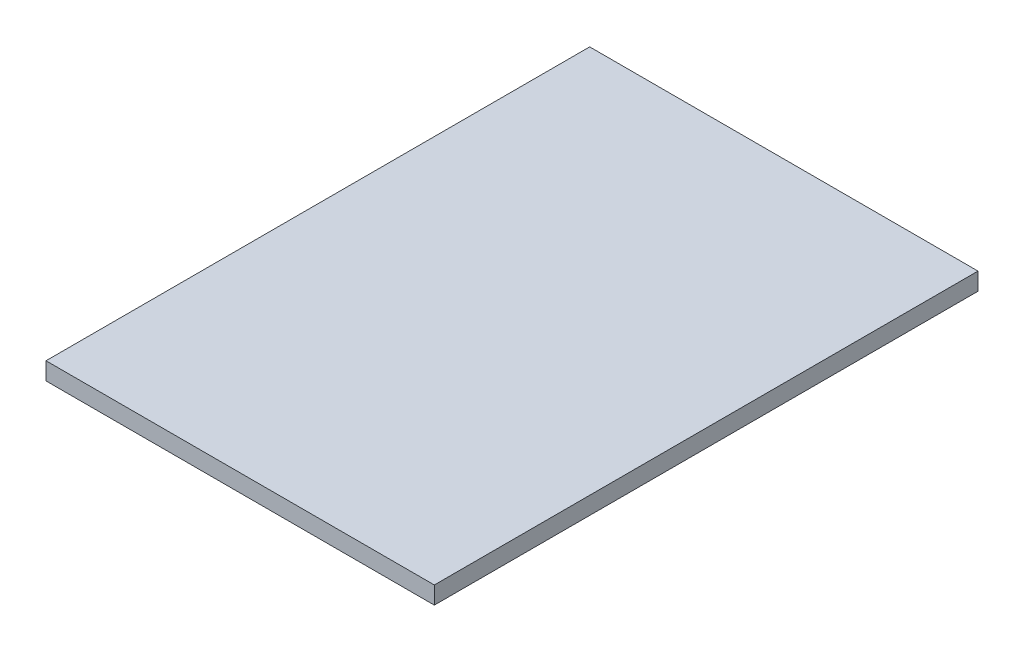
ISO-10303-21;
HEADER;
FILE_DESCRIPTION(('STEP AP214'),'2;1');
FILE_NAME('part.step','',(''),(''),'','','');
FILE_SCHEMA(('AUTOMOTIVE_DESIGN { 1 0 10303 214 1 1 1 1 }'));
ENDSEC;
DATA;
#1=APPLICATION_CONTEXT('core data for automotive mechanical design processes');
#2=APPLICATION_PROTOCOL_DEFINITION('international standard','automotive_design',2000,#1);
#3=PRODUCT_CONTEXT('',#1,'mechanical');
#4=PRODUCT('Part','Part','',(#3));
#5=PRODUCT_RELATED_PRODUCT_CATEGORY('part','',(#4));
#6=PRODUCT_DEFINITION_FORMATION('','',#4);
#7=PRODUCT_DEFINITION_CONTEXT('part definition',#1,'design');
#8=PRODUCT_DEFINITION('design','',#6,#7);
#9=PRODUCT_DEFINITION_SHAPE('','',#8);
#10=(LENGTH_UNIT() NAMED_UNIT(*) SI_UNIT(.MILLI.,.METRE.));
#11=(NAMED_UNIT(*) PLANE_ANGLE_UNIT() SI_UNIT($,.RADIAN.));
#12=(NAMED_UNIT(*) SI_UNIT($,.STERADIAN.) SOLID_ANGLE_UNIT());
#13=UNCERTAINTY_MEASURE_WITH_UNIT(LENGTH_MEASURE(1.E-05),#10,'distance_accuracy_value','');
#14=(GEOMETRIC_REPRESENTATION_CONTEXT(3) GLOBAL_UNCERTAINTY_ASSIGNED_CONTEXT((#13)) GLOBAL_UNIT_ASSIGNED_CONTEXT((#10,
#11,#12)) REPRESENTATION_CONTEXT('',''));
#15=CARTESIAN_POINT('',(0.,0.,0.));
#16=DIRECTION('',(0.,0.,1.));
#17=DIRECTION('',(1.,0.,0.));
#18=AXIS2_PLACEMENT_3D('',#15,#16,#17);
#19=CARTESIAN_POINT('',(10.,0.9,14.));
#20=DIRECTION('',(-1.,0.,0.));
#21=DIRECTION('',(0.,0.,1.));
#22=AXIS2_PLACEMENT_3D('',#19,#20,#21);
#23=PLANE('',#22);
#24=DIRECTION('',(0.,0.,-1.));
#25=VECTOR('',#24,1.);
#26=CARTESIAN_POINT('',(10.,0.,14.));
#27=LINE('',#26,#25);
#28=CARTESIAN_POINT('',(10.,0.,14.));
#29=VERTEX_POINT('',#28);
#30=CARTESIAN_POINT('',(10.,0.,-14.));
#31=VERTEX_POINT('',#30);
#32=EDGE_CURVE('E95',#29,#31,#27,.T.);
#33=ORIENTED_EDGE('',*,*,#32,.T.);
#34=DIRECTION('',(0.,-1.,0.));
#35=VECTOR('',#34,1.);
#36=CARTESIAN_POINT('',(10.,0.9,-14.));
#37=LINE('',#36,#35);
#38=CARTESIAN_POINT('',(10.,0.9,-14.));
#39=VERTEX_POINT('',#38);
#40=EDGE_CURVE('E11',#39,#31,#37,.T.);
#41=ORIENTED_EDGE('',*,*,#40,.F.);
#42=DIRECTION('',(0.,0.,-1.));
#43=VECTOR('',#42,1.);
#44=CARTESIAN_POINT('',(10.,0.9,14.));
#45=LINE('',#44,#43);
#46=CARTESIAN_POINT('',(10.,0.9,14.));
#47=VERTEX_POINT('',#46);
#48=EDGE_CURVE('E83',#47,#39,#45,.T.);
#49=ORIENTED_EDGE('',*,*,#48,.F.);
#50=DIRECTION('',(0.,-1.,0.));
#51=VECTOR('',#50,1.);
#52=CARTESIAN_POINT('',(10.,0.9,14.));
#53=LINE('',#52,#51);
#54=EDGE_CURVE('E91',#47,#29,#53,.T.);
#55=ORIENTED_EDGE('',*,*,#54,.T.);
#56=EDGE_LOOP('',(#33,#41,#49,#55));
#57=FACE_BOUND('',#56,.T.);
#58=ADVANCED_FACE('F32',(#57),#23,.F.);
#59=CARTESIAN_POINT('',(-10.,0.9,-14.));
#60=DIRECTION('',(0.,0.,1.));
#61=DIRECTION('',(1.,0.,0.));
#62=AXIS2_PLACEMENT_3D('',#59,#60,#61);
#63=PLANE('',#62);
#64=DIRECTION('',(-1.,0.,0.));
#65=VECTOR('',#64,1.);
#66=CARTESIAN_POINT('',(-10.,0.,-14.));
#67=LINE('',#66,#65);
#68=CARTESIAN_POINT('',(-10.,0.,-14.));
#69=VERTEX_POINT('',#68);
#70=EDGE_CURVE('E87',#31,#69,#67,.T.);
#71=ORIENTED_EDGE('',*,*,#70,.T.);
#72=DIRECTION('',(0.,-1.,0.));
#73=VECTOR('',#72,1.);
#74=CARTESIAN_POINT('',(-10.,0.9,-14.));
#75=LINE('',#74,#73);
#76=CARTESIAN_POINT('',(-10.,0.9,-14.));
#77=VERTEX_POINT('',#76);
#78=EDGE_CURVE('E40',#77,#69,#75,.T.);
#79=ORIENTED_EDGE('',*,*,#78,.F.);
#80=DIRECTION('',(-1.,0.,0.));
#81=VECTOR('',#80,1.);
#82=CARTESIAN_POINT('',(-10.,0.9,-14.));
#83=LINE('',#82,#81);
#84=EDGE_CURVE('E78',#39,#77,#83,.T.);
#85=ORIENTED_EDGE('',*,*,#84,.F.);
#86=ORIENTED_EDGE('',*,*,#40,.T.);
#87=EDGE_LOOP('',(#71,#79,#85,#86));
#88=FACE_BOUND('',#87,.T.);
#89=ADVANCED_FACE('F86',(#88),#63,.F.);
#90=CARTESIAN_POINT('',(-10.,0.9,14.));
#91=DIRECTION('',(1.,0.,0.));
#92=DIRECTION('',(0.,0.,-1.));
#93=AXIS2_PLACEMENT_3D('',#90,#91,#92);
#94=PLANE('',#93);
#95=DIRECTION('',(0.,0.,1.));
#96=VECTOR('',#95,1.);
#97=CARTESIAN_POINT('',(-10.,0.,14.));
#98=LINE('',#97,#96);
#99=CARTESIAN_POINT('',(-10.,0.,14.));
#100=VERTEX_POINT('',#99);
#101=EDGE_CURVE('E65',#69,#100,#98,.T.);
#102=ORIENTED_EDGE('',*,*,#101,.T.);
#103=DIRECTION('',(0.,-1.,0.));
#104=VECTOR('',#103,1.);
#105=CARTESIAN_POINT('',(-10.,0.9,14.));
#106=LINE('',#105,#104);
#107=CARTESIAN_POINT('',(-10.,0.9,14.));
#108=VERTEX_POINT('',#107);
#109=EDGE_CURVE('E88',#108,#100,#106,.T.);
#110=ORIENTED_EDGE('',*,*,#109,.F.);
#111=DIRECTION('',(0.,0.,1.));
#112=VECTOR('',#111,1.);
#113=CARTESIAN_POINT('',(-10.,0.9,14.));
#114=LINE('',#113,#112);
#115=EDGE_CURVE('E81',#77,#108,#114,.T.);
#116=ORIENTED_EDGE('',*,*,#115,.F.);
#117=ORIENTED_EDGE('',*,*,#78,.T.);
#118=EDGE_LOOP('',(#102,#110,#116,#117));
#119=FACE_BOUND('',#118,.T.);
#120=ADVANCED_FACE('F89',(#119),#94,.F.);
#121=CARTESIAN_POINT('',(-10.,0.9,14.));
#122=DIRECTION('',(0.,0.,-1.));
#123=DIRECTION('',(-1.,0.,0.));
#124=AXIS2_PLACEMENT_3D('',#121,#122,#123);
#125=PLANE('',#124);
#126=DIRECTION('',(1.,0.,0.));
#127=VECTOR('',#126,1.);
#128=CARTESIAN_POINT('',(-10.,0.,14.));
#129=LINE('',#128,#127);
#130=EDGE_CURVE('E71',#100,#29,#129,.T.);
#131=ORIENTED_EDGE('',*,*,#130,.T.);
#132=ORIENTED_EDGE('',*,*,#54,.F.);
#133=DIRECTION('',(1.,0.,0.));
#134=VECTOR('',#133,1.);
#135=CARTESIAN_POINT('',(-10.,0.9,14.));
#136=LINE('',#135,#134);
#137=EDGE_CURVE('E48',#108,#47,#136,.T.);
#138=ORIENTED_EDGE('',*,*,#137,.F.);
#139=ORIENTED_EDGE('',*,*,#109,.T.);
#140=EDGE_LOOP('',(#131,#132,#138,#139));
#141=FACE_BOUND('',#140,.T.);
#142=ADVANCED_FACE('F102',(#141),#125,.F.);
#143=CARTESIAN_POINT('',(0.,0.9,0.));
#144=DIRECTION('',(0.,-1.,0.));
#145=DIRECTION('',(0.,0.,-1.));
#146=AXIS2_PLACEMENT_3D('',#143,#144,#145);
#147=PLANE('',#146);
#148=ORIENTED_EDGE('',*,*,#48,.T.);
#149=ORIENTED_EDGE('',*,*,#84,.T.);
#150=ORIENTED_EDGE('',*,*,#115,.T.);
#151=ORIENTED_EDGE('',*,*,#137,.T.);
#152=EDGE_LOOP('',(#148,#149,#150,#151));
#153=FACE_BOUND('',#152,.T.);
#154=ADVANCED_FACE('F79',(#153),#147,.F.);
#155=CARTESIAN_POINT('',(0.,0.,0.));
#156=DIRECTION('',(0.,-1.,0.));
#157=DIRECTION('',(0.,0.,-1.));
#158=AXIS2_PLACEMENT_3D('',#155,#156,#157);
#159=PLANE('',#158);
#160=ORIENTED_EDGE('',*,*,#32,.F.);
#161=ORIENTED_EDGE('',*,*,#130,.F.);
#162=ORIENTED_EDGE('',*,*,#101,.F.);
#163=ORIENTED_EDGE('',*,*,#70,.F.);
#164=EDGE_LOOP('',(#160,#161,#162,#163));
#165=FACE_BOUND('',#164,.T.);
#166=ADVANCED_FACE('F105',(#165),#159,.T.);
#167=CLOSED_SHELL('',(#58,#89,#120,#142,#154,#166));
#168=MANIFOLD_SOLID_BREP('B2',#167);
#169=ADVANCED_BREP_SHAPE_REPRESENTATION('',(#18,#168),#14);
#170=SHAPE_DEFINITION_REPRESENTATION(#9,#169);
ENDSEC;
END-ISO-10303-21;
